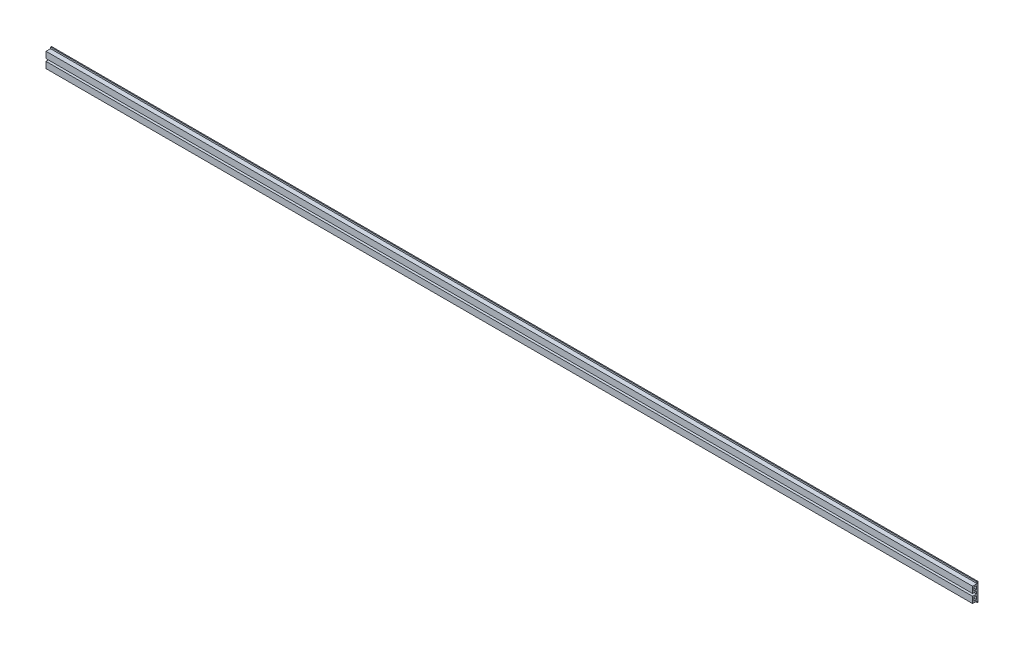
ISO-10303-21;
HEADER;
FILE_DESCRIPTION(('STEP AP214'),'2;1');
FILE_NAME('part.step','',(''),(''),'','','');
FILE_SCHEMA(('AUTOMOTIVE_DESIGN { 1 0 10303 214 1 1 1 1 }'));
ENDSEC;
DATA;
#1=APPLICATION_CONTEXT('core data for automotive mechanical design processes');
#2=APPLICATION_PROTOCOL_DEFINITION('international standard','automotive_design',2000,#1);
#3=PRODUCT_CONTEXT('',#1,'mechanical');
#4=PRODUCT('Part','Part','',(#3));
#5=PRODUCT_RELATED_PRODUCT_CATEGORY('part','',(#4));
#6=PRODUCT_DEFINITION_FORMATION('','',#4);
#7=PRODUCT_DEFINITION_CONTEXT('part definition',#1,'design');
#8=PRODUCT_DEFINITION('design','',#6,#7);
#9=PRODUCT_DEFINITION_SHAPE('','',#8);
#10=(LENGTH_UNIT() NAMED_UNIT(*) SI_UNIT(.MILLI.,.METRE.));
#11=(NAMED_UNIT(*) PLANE_ANGLE_UNIT() SI_UNIT($,.RADIAN.));
#12=(NAMED_UNIT(*) SI_UNIT($,.STERADIAN.) SOLID_ANGLE_UNIT());
#13=UNCERTAINTY_MEASURE_WITH_UNIT(LENGTH_MEASURE(1.E-05),#10,'distance_accuracy_value','');
#14=(GEOMETRIC_REPRESENTATION_CONTEXT(3) GLOBAL_UNCERTAINTY_ASSIGNED_CONTEXT((#13)) GLOBAL_UNIT_ASSIGNED_CONTEXT((#10,
#11,#12)) REPRESENTATION_CONTEXT('',''));
#15=CARTESIAN_POINT('',(0.,0.,0.));
#16=DIRECTION('',(0.,0.,1.));
#17=DIRECTION('',(1.,0.,0.));
#18=AXIS2_PLACEMENT_3D('',#15,#16,#17);
#19=CARTESIAN_POINT('',(-3142.64183905346,-30.,0.));
#20=DIRECTION('',(0.,0.,-1.));
#21=DIRECTION('',(-1.,0.,0.));
#22=AXIS2_PLACEMENT_3D('',#19,#20,#21);
#23=PLANE('',#22);
#24=DIRECTION('',(0.,-1.,0.));
#25=VECTOR('',#24,1.);
#26=CARTESIAN_POINT('',(-3080.,-30.,0.));
#27=LINE('',#26,#25);
#28=CARTESIAN_POINT('',(-3080.,30.,0.));
#29=VERTEX_POINT('',#28);
#30=CARTESIAN_POINT('',(-3080.,-30.,0.));
#31=VERTEX_POINT('',#30);
#32=EDGE_CURVE('E11',#29,#31,#27,.T.);
#33=ORIENTED_EDGE('',*,*,#32,.F.);
#34=DIRECTION('',(1.,0.,0.));
#35=VECTOR('',#34,1.);
#36=CARTESIAN_POINT('',(-3142.64183905346,30.,0.));
#37=LINE('',#36,#35);
#38=CARTESIAN_POINT('',(0.,30.,0.));
#39=VERTEX_POINT('',#38);
#40=EDGE_CURVE('E283',#29,#39,#37,.T.);
#41=ORIENTED_EDGE('',*,*,#40,.T.);
#42=DIRECTION('',(0.,1.,0.));
#43=VECTOR('',#42,1.);
#44=CARTESIAN_POINT('',(0.,-30.,0.));
#45=LINE('',#44,#43);
#46=CARTESIAN_POINT('',(0.,-30.,0.));
#47=VERTEX_POINT('',#46);
#48=EDGE_CURVE('E229',#47,#39,#45,.T.);
#49=ORIENTED_EDGE('',*,*,#48,.F.);
#50=DIRECTION('',(1.,0.,0.));
#51=VECTOR('',#50,1.);
#52=CARTESIAN_POINT('',(-3142.64183905346,-30.,0.));
#53=LINE('',#52,#51);
#54=EDGE_CURVE('E262',#31,#47,#53,.T.);
#55=ORIENTED_EDGE('',*,*,#54,.F.);
#56=EDGE_LOOP('',(#33,#41,#49,#55));
#57=FACE_BOUND('',#56,.T.);
#58=ADVANCED_FACE('F33',(#57),#23,.T.);
#59=CARTESIAN_POINT('',(-3142.64183905346,30.,0.));
#60=DIRECTION('',(0.,1.,0.));
#61=DIRECTION('',(0.,0.,1.));
#62=AXIS2_PLACEMENT_3D('',#59,#60,#61);
#63=PLANE('',#62);
#64=DIRECTION('',(0.,0.,-1.));
#65=VECTOR('',#64,1.);
#66=CARTESIAN_POINT('',(-3080.,30.,0.));
#67=LINE('',#66,#65);
#68=CARTESIAN_POINT('',(-3080.,30.,3.));
#69=VERTEX_POINT('',#68);
#70=EDGE_CURVE('E326',#69,#29,#67,.T.);
#71=ORIENTED_EDGE('',*,*,#70,.F.);
#72=DIRECTION('',(1.,0.,0.));
#73=VECTOR('',#72,1.);
#74=CARTESIAN_POINT('',(-3142.64183905346,30.,3.));
#75=LINE('',#74,#73);
#76=CARTESIAN_POINT('',(0.,30.,3.));
#77=VERTEX_POINT('',#76);
#78=EDGE_CURVE('E281',#69,#77,#75,.T.);
#79=ORIENTED_EDGE('',*,*,#78,.T.);
#80=DIRECTION('',(0.,0.,1.));
#81=VECTOR('',#80,1.);
#82=CARTESIAN_POINT('',(0.,30.,0.));
#83=LINE('',#82,#81);
#84=EDGE_CURVE('E232',#39,#77,#83,.T.);
#85=ORIENTED_EDGE('',*,*,#84,.F.);
#86=ORIENTED_EDGE('',*,*,#40,.F.);
#87=EDGE_LOOP('',(#71,#79,#85,#86));
#88=FACE_BOUND('',#87,.T.);
#89=ADVANCED_FACE('F382',(#88),#63,.T.);
#90=CARTESIAN_POINT('',(-3142.64183905346,30.,3.));
#91=DIRECTION('',(0.,0.,1.));
#92=DIRECTION('',(0.,-1.,0.));
#93=AXIS2_PLACEMENT_3D('',#90,#91,#92);
#94=PLANE('',#93);
#95=DIRECTION('',(0.,1.,0.));
#96=VECTOR('',#95,1.);
#97=CARTESIAN_POINT('',(-3080.,30.,3.));
#98=LINE('',#97,#96);
#99=CARTESIAN_POINT('',(-3080.,25.,3.));
#100=VERTEX_POINT('',#99);
#101=EDGE_CURVE('E332',#100,#69,#98,.T.);
#102=ORIENTED_EDGE('',*,*,#101,.F.);
#103=DIRECTION('',(1.,0.,0.));
#104=VECTOR('',#103,1.);
#105=CARTESIAN_POINT('',(-3142.64183905346,25.,3.));
#106=LINE('',#105,#104);
#107=CARTESIAN_POINT('',(0.,25.,3.));
#108=VERTEX_POINT('',#107);
#109=EDGE_CURVE('E279',#100,#108,#106,.T.);
#110=ORIENTED_EDGE('',*,*,#109,.T.);
#111=DIRECTION('',(0.,-1.,0.));
#112=VECTOR('',#111,1.);
#113=CARTESIAN_POINT('',(0.,30.,3.));
#114=LINE('',#113,#112);
#115=EDGE_CURVE('E235',#77,#108,#114,.T.);
#116=ORIENTED_EDGE('',*,*,#115,.F.);
#117=ORIENTED_EDGE('',*,*,#78,.F.);
#118=EDGE_LOOP('',(#102,#110,#116,#117));
#119=FACE_BOUND('',#118,.T.);
#120=ADVANCED_FACE('F378',(#119),#94,.T.);
#121=CARTESIAN_POINT('',(-3142.64183905346,25.,3.));
#122=DIRECTION('',(0.,1.,0.));
#123=DIRECTION('',(0.,0.,1.));
#124=AXIS2_PLACEMENT_3D('',#121,#122,#123);
#125=PLANE('',#124);
#126=DIRECTION('',(0.,0.,-1.));
#127=VECTOR('',#126,1.);
#128=CARTESIAN_POINT('',(-3080.,25.,2.99999999999997));
#129=LINE('',#128,#127);
#130=CARTESIAN_POINT('',(-3080.,25.,18.));
#131=VERTEX_POINT('',#130);
#132=EDGE_CURVE('E334',#131,#100,#129,.T.);
#133=ORIENTED_EDGE('',*,*,#132,.F.);
#134=DIRECTION('',(1.,0.,0.));
#135=VECTOR('',#134,1.);
#136=CARTESIAN_POINT('',(-3142.64183905346,25.,18.));
#137=LINE('',#136,#135);
#138=CARTESIAN_POINT('',(0.,25.,18.));
#139=VERTEX_POINT('',#138);
#140=EDGE_CURVE('E277',#131,#139,#137,.T.);
#141=ORIENTED_EDGE('',*,*,#140,.T.);
#142=DIRECTION('',(0.,0.,1.));
#143=VECTOR('',#142,1.);
#144=CARTESIAN_POINT('',(0.,25.,3.));
#145=LINE('',#144,#143);
#146=EDGE_CURVE('E238',#108,#139,#145,.T.);
#147=ORIENTED_EDGE('',*,*,#146,.F.);
#148=ORIENTED_EDGE('',*,*,#109,.F.);
#149=EDGE_LOOP('',(#133,#141,#147,#148));
#150=FACE_BOUND('',#149,.T.);
#151=ADVANCED_FACE('F374',(#150),#125,.T.);
#152=CARTESIAN_POINT('',(-3142.64183905346,25.,18.));
#153=DIRECTION('',(0.,0.,1.));
#154=DIRECTION('',(0.,-1.,0.));
#155=AXIS2_PLACEMENT_3D('',#152,#153,#154);
#156=PLANE('',#155);
#157=DIRECTION('',(0.,1.,0.));
#158=VECTOR('',#157,1.);
#159=CARTESIAN_POINT('',(-3080.,25.,18.));
#160=LINE('',#159,#158);
#161=CARTESIAN_POINT('',(-3080.,4.,18.));
#162=VERTEX_POINT('',#161);
#163=EDGE_CURVE('E336',#162,#131,#160,.T.);
#164=ORIENTED_EDGE('',*,*,#163,.F.);
#165=DIRECTION('',(1.,0.,0.));
#166=VECTOR('',#165,1.);
#167=CARTESIAN_POINT('',(-3142.64183905346,4.,18.));
#168=LINE('',#167,#166);
#169=CARTESIAN_POINT('',(0.,4.,18.));
#170=VERTEX_POINT('',#169);
#171=EDGE_CURVE('E275',#162,#170,#168,.T.);
#172=ORIENTED_EDGE('',*,*,#171,.T.);
#173=DIRECTION('',(0.,-1.,0.));
#174=VECTOR('',#173,1.);
#175=CARTESIAN_POINT('',(0.,25.,18.));
#176=LINE('',#175,#174);
#177=EDGE_CURVE('E241',#139,#170,#176,.T.);
#178=ORIENTED_EDGE('',*,*,#177,.F.);
#179=ORIENTED_EDGE('',*,*,#140,.F.);
#180=EDGE_LOOP('',(#164,#172,#178,#179));
#181=FACE_BOUND('',#180,.T.);
#182=ADVANCED_FACE('F368',(#181),#156,.T.);
#183=CARTESIAN_POINT('',(-3142.64183905346,4.,18.));
#184=DIRECTION('',(0.,-1.,0.));
#185=DIRECTION('',(0.,0.,-1.));
#186=AXIS2_PLACEMENT_3D('',#183,#184,#185);
#187=PLANE('',#186);
#188=DIRECTION('',(0.,0.,1.));
#189=VECTOR('',#188,1.);
#190=CARTESIAN_POINT('',(-3080.,4.,18.));
#191=LINE('',#190,#189);
#192=CARTESIAN_POINT('',(-3080.,4.,5.));
#193=VERTEX_POINT('',#192);
#194=EDGE_CURVE('E338',#193,#162,#191,.T.);
#195=ORIENTED_EDGE('',*,*,#194,.F.);
#196=DIRECTION('',(1.,0.,0.));
#197=VECTOR('',#196,1.);
#198=CARTESIAN_POINT('',(-3142.64183905346,4.,5.));
#199=LINE('',#198,#197);
#200=CARTESIAN_POINT('',(0.,4.,5.));
#201=VERTEX_POINT('',#200);
#202=EDGE_CURVE('E273',#193,#201,#199,.T.);
#203=ORIENTED_EDGE('',*,*,#202,.T.);
#204=DIRECTION('',(0.,0.,-1.));
#205=VECTOR('',#204,1.);
#206=CARTESIAN_POINT('',(0.,4.,18.));
#207=LINE('',#206,#205);
#208=EDGE_CURVE('E244',#170,#201,#207,.T.);
#209=ORIENTED_EDGE('',*,*,#208,.F.);
#210=ORIENTED_EDGE('',*,*,#171,.F.);
#211=EDGE_LOOP('',(#195,#203,#209,#210));
#212=FACE_BOUND('',#211,.T.);
#213=ADVANCED_FACE('F365',(#212),#187,.T.);
#214=CARTESIAN_POINT('',(-3142.64183905346,4.,5.));
#215=DIRECTION('',(0.,0.,1.));
#216=DIRECTION('',(0.,-1.,0.));
#217=AXIS2_PLACEMENT_3D('',#214,#215,#216);
#218=PLANE('',#217);
#219=DIRECTION('',(0.,1.,0.));
#220=VECTOR('',#219,1.);
#221=CARTESIAN_POINT('',(-3080.,4.,5.));
#222=LINE('',#221,#220);
#223=CARTESIAN_POINT('',(-3080.,-4.,5.));
#224=VERTEX_POINT('',#223);
#225=EDGE_CURVE('E340',#224,#193,#222,.T.);
#226=ORIENTED_EDGE('',*,*,#225,.F.);
#227=DIRECTION('',(1.,0.,0.));
#228=VECTOR('',#227,1.);
#229=CARTESIAN_POINT('',(-3142.64183905346,-4.,5.));
#230=LINE('',#229,#228);
#231=CARTESIAN_POINT('',(0.,-4.,5.));
#232=VERTEX_POINT('',#231);
#233=EDGE_CURVE('E271',#224,#232,#230,.T.);
#234=ORIENTED_EDGE('',*,*,#233,.T.);
#235=DIRECTION('',(0.,-1.,0.));
#236=VECTOR('',#235,1.);
#237=CARTESIAN_POINT('',(0.,4.,5.));
#238=LINE('',#237,#236);
#239=EDGE_CURVE('E247',#201,#232,#238,.T.);
#240=ORIENTED_EDGE('',*,*,#239,.F.);
#241=ORIENTED_EDGE('',*,*,#202,.F.);
#242=EDGE_LOOP('',(#226,#234,#240,#241));
#243=FACE_BOUND('',#242,.T.);
#244=ADVANCED_FACE('F360',(#243),#218,.T.);
#245=CARTESIAN_POINT('',(-3142.64183905346,-4.,5.));
#246=DIRECTION('',(0.,1.,0.));
#247=DIRECTION('',(0.,0.,1.));
#248=AXIS2_PLACEMENT_3D('',#245,#246,#247);
#249=PLANE('',#248);
#250=DIRECTION('',(0.,0.,-1.));
#251=VECTOR('',#250,1.);
#252=CARTESIAN_POINT('',(-3080.,-4.,4.99999999999997));
#253=LINE('',#252,#251);
#254=CARTESIAN_POINT('',(-3080.,-4.,18.));
#255=VERTEX_POINT('',#254);
#256=EDGE_CURVE('E342',#255,#224,#253,.T.);
#257=ORIENTED_EDGE('',*,*,#256,.F.);
#258=DIRECTION('',(1.,0.,0.));
#259=VECTOR('',#258,1.);
#260=CARTESIAN_POINT('',(-3142.64183905346,-4.,18.));
#261=LINE('',#260,#259);
#262=CARTESIAN_POINT('',(0.,-4.,18.));
#263=VERTEX_POINT('',#262);
#264=EDGE_CURVE('E269',#255,#263,#261,.T.);
#265=ORIENTED_EDGE('',*,*,#264,.T.);
#266=DIRECTION('',(0.,0.,1.));
#267=VECTOR('',#266,1.);
#268=CARTESIAN_POINT('',(0.,-4.,5.));
#269=LINE('',#268,#267);
#270=EDGE_CURVE('E250',#232,#263,#269,.T.);
#271=ORIENTED_EDGE('',*,*,#270,.F.);
#272=ORIENTED_EDGE('',*,*,#233,.F.);
#273=EDGE_LOOP('',(#257,#265,#271,#272));
#274=FACE_BOUND('',#273,.T.);
#275=ADVANCED_FACE('F352',(#274),#249,.T.);
#276=CARTESIAN_POINT('',(-3142.64183905346,-4.,18.));
#277=DIRECTION('',(0.,0.,1.));
#278=DIRECTION('',(1.,0.,0.));
#279=AXIS2_PLACEMENT_3D('',#276,#277,#278);
#280=PLANE('',#279);
#281=DIRECTION('',(0.,1.,0.));
#282=VECTOR('',#281,1.);
#283=CARTESIAN_POINT('',(-3080.,-4.,18.));
#284=LINE('',#283,#282);
#285=CARTESIAN_POINT('',(-3080.,-25.,18.));
#286=VERTEX_POINT('',#285);
#287=EDGE_CURVE('E309',#286,#255,#284,.T.);
#288=ORIENTED_EDGE('',*,*,#287,.F.);
#289=DIRECTION('',(1.,0.,0.));
#290=VECTOR('',#289,1.);
#291=CARTESIAN_POINT('',(-3142.64183905346,-25.,18.));
#292=LINE('',#291,#290);
#293=CARTESIAN_POINT('',(0.,-25.,18.));
#294=VERTEX_POINT('',#293);
#295=EDGE_CURVE('E267',#286,#294,#292,.T.);
#296=ORIENTED_EDGE('',*,*,#295,.T.);
#297=DIRECTION('',(0.,-1.,0.));
#298=VECTOR('',#297,1.);
#299=CARTESIAN_POINT('',(0.,-4.,18.));
#300=LINE('',#299,#298);
#301=EDGE_CURVE('E253',#263,#294,#300,.T.);
#302=ORIENTED_EDGE('',*,*,#301,.F.);
#303=ORIENTED_EDGE('',*,*,#264,.F.);
#304=EDGE_LOOP('',(#288,#296,#302,#303));
#305=FACE_BOUND('',#304,.T.);
#306=ADVANCED_FACE('F355',(#305),#280,.T.);
#307=CARTESIAN_POINT('',(-3142.64183905346,-25.,18.));
#308=DIRECTION('',(0.,-1.,0.));
#309=DIRECTION('',(0.,0.,-1.));
#310=AXIS2_PLACEMENT_3D('',#307,#308,#309);
#311=PLANE('',#310);
#312=DIRECTION('',(0.,0.,1.));
#313=VECTOR('',#312,1.);
#314=CARTESIAN_POINT('',(-3080.,-25.,18.));
#315=LINE('',#314,#313);
#316=CARTESIAN_POINT('',(-3080.,-25.,2.99999999999999));
#317=VERTEX_POINT('',#316);
#318=EDGE_CURVE('E305',#317,#286,#315,.T.);
#319=ORIENTED_EDGE('',*,*,#318,.F.);
#320=DIRECTION('',(1.,0.,0.));
#321=VECTOR('',#320,1.);
#322=CARTESIAN_POINT('',(-3142.64183905346,-25.,2.99999999999999));
#323=LINE('',#322,#321);
#324=CARTESIAN_POINT('',(0.,-25.,2.99999999999999));
#325=VERTEX_POINT('',#324);
#326=EDGE_CURVE('E265',#317,#325,#323,.T.);
#327=ORIENTED_EDGE('',*,*,#326,.T.);
#328=DIRECTION('',(0.,0.,-1.));
#329=VECTOR('',#328,1.);
#330=CARTESIAN_POINT('',(0.,-25.,18.));
#331=LINE('',#330,#329);
#332=EDGE_CURVE('E256',#294,#325,#331,.T.);
#333=ORIENTED_EDGE('',*,*,#332,.F.);
#334=ORIENTED_EDGE('',*,*,#295,.F.);
#335=EDGE_LOOP('',(#319,#327,#333,#334));
#336=FACE_BOUND('',#335,.T.);
#337=ADVANCED_FACE('F403',(#336),#311,.T.);
#338=CARTESIAN_POINT('',(-3142.64183905346,-25.,2.99999999999999));
#339=DIRECTION('',(0.,0.,1.));
#340=DIRECTION('',(0.,-1.,0.));
#341=AXIS2_PLACEMENT_3D('',#338,#339,#340);
#342=PLANE('',#341);
#343=DIRECTION('',(0.,1.,0.));
#344=VECTOR('',#343,1.);
#345=CARTESIAN_POINT('',(-3080.,-25.,2.99999999999999));
#346=LINE('',#345,#344);
#347=CARTESIAN_POINT('',(-3080.,-30.,2.99999999999999));
#348=VERTEX_POINT('',#347);
#349=EDGE_CURVE('E302',#348,#317,#346,.T.);
#350=ORIENTED_EDGE('',*,*,#349,.F.);
#351=DIRECTION('',(1.,0.,0.));
#352=VECTOR('',#351,1.);
#353=CARTESIAN_POINT('',(-3142.64183905346,-30.,2.99999999999999));
#354=LINE('',#353,#352);
#355=CARTESIAN_POINT('',(0.,-30.,2.99999999999999));
#356=VERTEX_POINT('',#355);
#357=EDGE_CURVE('E263',#348,#356,#354,.T.);
#358=ORIENTED_EDGE('',*,*,#357,.T.);
#359=DIRECTION('',(0.,-1.,0.));
#360=VECTOR('',#359,1.);
#361=CARTESIAN_POINT('',(0.,-25.,2.99999999999999));
#362=LINE('',#361,#360);
#363=EDGE_CURVE('E259',#325,#356,#362,.T.);
#364=ORIENTED_EDGE('',*,*,#363,.F.);
#365=ORIENTED_EDGE('',*,*,#326,.F.);
#366=EDGE_LOOP('',(#350,#358,#364,#365));
#367=FACE_BOUND('',#366,.T.);
#368=ADVANCED_FACE('F301',(#367),#342,.T.);
#369=CARTESIAN_POINT('',(-3142.64183905346,-30.,2.99999999999999));
#370=DIRECTION('',(0.,-1.,0.));
#371=DIRECTION('',(0.,0.,-1.));
#372=AXIS2_PLACEMENT_3D('',#369,#370,#371);
#373=PLANE('',#372);
#374=DIRECTION('',(0.,0.,1.));
#375=VECTOR('',#374,1.);
#376=CARTESIAN_POINT('',(-3080.,-30.,2.99999999999996));
#377=LINE('',#376,#375);
#378=EDGE_CURVE('E290',#31,#348,#377,.T.);
#379=ORIENTED_EDGE('',*,*,#378,.F.);
#380=ORIENTED_EDGE('',*,*,#54,.T.);
#381=DIRECTION('',(0.,0.,-1.));
#382=VECTOR('',#381,1.);
#383=CARTESIAN_POINT('',(0.,-30.,2.99999999999999));
#384=LINE('',#383,#382);
#385=EDGE_CURVE('E221',#356,#47,#384,.T.);
#386=ORIENTED_EDGE('',*,*,#385,.F.);
#387=ORIENTED_EDGE('',*,*,#357,.F.);
#388=EDGE_LOOP('',(#379,#380,#386,#387));
#389=FACE_BOUND('',#388,.T.);
#390=ADVANCED_FACE('F35',(#389),#373,.T.);
#391=CARTESIAN_POINT('',(-3142.64183905346,20.,5.));
#392=DIRECTION('',(0.,1.,0.));
#393=DIRECTION('',(0.,0.,1.));
#394=AXIS2_PLACEMENT_3D('',#391,#392,#393);
#395=PLANE('',#394);
#396=DIRECTION('',(1.,0.,0.));
#397=VECTOR('',#396,1.);
#398=CARTESIAN_POINT('',(-3142.64183905346,20.,13.));
#399=LINE('',#398,#397);
#400=CARTESIAN_POINT('',(-3080.,20.,13.));
#401=VERTEX_POINT('',#400);
#402=CARTESIAN_POINT('',(0.,20.,13.));
#403=VERTEX_POINT('',#402);
#404=EDGE_CURVE('E224',#401,#403,#399,.T.);
#405=ORIENTED_EDGE('',*,*,#404,.F.);
#406=DIRECTION('',(0.,0.,-1.));
#407=VECTOR('',#406,1.);
#408=CARTESIAN_POINT('',(-3080.,20.,4.99999999999997));
#409=LINE('',#408,#407);
#410=CARTESIAN_POINT('',(-3080.,20.,5.));
#411=VERTEX_POINT('',#410);
#412=EDGE_CURVE('E52',#401,#411,#409,.T.);
#413=ORIENTED_EDGE('',*,*,#412,.T.);
#414=DIRECTION('',(1.,0.,0.));
#415=VECTOR('',#414,1.);
#416=CARTESIAN_POINT('',(-3142.64183905346,20.,5.));
#417=LINE('',#416,#415);
#418=CARTESIAN_POINT('',(0.,20.,5.));
#419=VERTEX_POINT('',#418);
#420=EDGE_CURVE('E218',#411,#419,#417,.T.);
#421=ORIENTED_EDGE('',*,*,#420,.T.);
#422=DIRECTION('',(0.,0.,1.));
#423=VECTOR('',#422,1.);
#424=CARTESIAN_POINT('',(0.,20.,5.));
#425=LINE('',#424,#423);
#426=EDGE_CURVE('E209',#419,#403,#425,.T.);
#427=ORIENTED_EDGE('',*,*,#426,.T.);
#428=EDGE_LOOP('',(#405,#413,#421,#427));
#429=FACE_BOUND('',#428,.T.);
#430=ADVANCED_FACE('F416',(#429),#395,.F.);
#431=CARTESIAN_POINT('',(-3142.64183905346,20.,13.));
#432=DIRECTION('',(0.,0.,1.));
#433=DIRECTION('',(1.,0.,0.));
#434=AXIS2_PLACEMENT_3D('',#431,#432,#433);
#435=PLANE('',#434);
#436=DIRECTION('',(1.,0.,0.));
#437=VECTOR('',#436,1.);
#438=CARTESIAN_POINT('',(-3142.64183905346,9.,13.));
#439=LINE('',#438,#437);
#440=CARTESIAN_POINT('',(-3080.,9.,13.));
#441=VERTEX_POINT('',#440);
#442=CARTESIAN_POINT('',(0.,9.,13.));
#443=VERTEX_POINT('',#442);
#444=EDGE_CURVE('E222',#441,#443,#439,.T.);
#445=ORIENTED_EDGE('',*,*,#444,.F.);
#446=DIRECTION('',(0.,1.,0.));
#447=VECTOR('',#446,1.);
#448=CARTESIAN_POINT('',(-3080.,20.,13.));
#449=LINE('',#448,#447);
#450=EDGE_CURVE('E43',#441,#401,#449,.T.);
#451=ORIENTED_EDGE('',*,*,#450,.T.);
#452=ORIENTED_EDGE('',*,*,#404,.T.);
#453=DIRECTION('',(0.,-1.,0.));
#454=VECTOR('',#453,1.);
#455=CARTESIAN_POINT('',(0.,20.,13.));
#456=LINE('',#455,#454);
#457=EDGE_CURVE('E212',#403,#443,#456,.T.);
#458=ORIENTED_EDGE('',*,*,#457,.T.);
#459=EDGE_LOOP('',(#445,#451,#452,#458));
#460=FACE_BOUND('',#459,.T.);
#461=ADVANCED_FACE('F419',(#460),#435,.F.);
#462=CARTESIAN_POINT('',(-3142.64183905346,9.,13.));
#463=DIRECTION('',(0.,-1.,0.));
#464=DIRECTION('',(0.,0.,-1.));
#465=AXIS2_PLACEMENT_3D('',#462,#463,#464);
#466=PLANE('',#465);
#467=DIRECTION('',(1.,0.,0.));
#468=VECTOR('',#467,1.);
#469=CARTESIAN_POINT('',(-3142.64183905346,9.,5.));
#470=LINE('',#469,#468);
#471=CARTESIAN_POINT('',(-3080.,9.,5.));
#472=VERTEX_POINT('',#471);
#473=CARTESIAN_POINT('',(0.,9.,5.));
#474=VERTEX_POINT('',#473);
#475=EDGE_CURVE('E219',#472,#474,#470,.T.);
#476=ORIENTED_EDGE('',*,*,#475,.F.);
#477=DIRECTION('',(0.,0.,1.));
#478=VECTOR('',#477,1.);
#479=CARTESIAN_POINT('',(-3080.,9.,13.));
#480=LINE('',#479,#478);
#481=EDGE_CURVE('E72',#472,#441,#480,.T.);
#482=ORIENTED_EDGE('',*,*,#481,.T.);
#483=ORIENTED_EDGE('',*,*,#444,.T.);
#484=DIRECTION('',(0.,0.,-1.));
#485=VECTOR('',#484,1.);
#486=CARTESIAN_POINT('',(0.,9.,13.));
#487=LINE('',#486,#485);
#488=EDGE_CURVE('E215',#443,#474,#487,.T.);
#489=ORIENTED_EDGE('',*,*,#488,.T.);
#490=EDGE_LOOP('',(#476,#482,#483,#489));
#491=FACE_BOUND('',#490,.T.);
#492=ADVANCED_FACE('F414',(#491),#466,.F.);
#493=CARTESIAN_POINT('',(-3142.64183905346,9.,5.));
#494=DIRECTION('',(0.,0.,-1.));
#495=DIRECTION('',(-1.,0.,0.));
#496=AXIS2_PLACEMENT_3D('',#493,#494,#495);
#497=PLANE('',#496);
#498=ORIENTED_EDGE('',*,*,#420,.F.);
#499=DIRECTION('',(0.,-1.,0.));
#500=VECTOR('',#499,1.);
#501=CARTESIAN_POINT('',(-3080.,9.,5.));
#502=LINE('',#501,#500);
#503=EDGE_CURVE('E321',#411,#472,#502,.T.);
#504=ORIENTED_EDGE('',*,*,#503,.T.);
#505=ORIENTED_EDGE('',*,*,#475,.T.);
#506=DIRECTION('',(0.,1.,0.));
#507=VECTOR('',#506,1.);
#508=CARTESIAN_POINT('',(0.,9.,5.));
#509=LINE('',#508,#507);
#510=EDGE_CURVE('E204',#474,#419,#509,.T.);
#511=ORIENTED_EDGE('',*,*,#510,.T.);
#512=EDGE_LOOP('',(#498,#504,#505,#511));
#513=FACE_BOUND('',#512,.T.);
#514=ADVANCED_FACE('F411',(#513),#497,.F.);
#515=CARTESIAN_POINT('',(0.,0.,0.));
#516=DIRECTION('',(1.,0.,0.));
#517=DIRECTION('',(0.,0.,-1.));
#518=AXIS2_PLACEMENT_3D('',#515,#516,#517);
#519=PLANE('',#518);
#520=DIRECTION('',(0.,1.,0.));
#521=VECTOR('',#520,1.);
#522=CARTESIAN_POINT('',(0.,-9.,5.));
#523=LINE('',#522,#521);
#524=CARTESIAN_POINT('',(0.,-20.,5.));
#525=VERTEX_POINT('',#524);
#526=CARTESIAN_POINT('',(0.,-9.,5.));
#527=VERTEX_POINT('',#526);
#528=EDGE_CURVE('E192',#525,#527,#523,.T.);
#529=ORIENTED_EDGE('',*,*,#528,.F.);
#530=DIRECTION('',(0.,0.,-1.));
#531=VECTOR('',#530,1.);
#532=CARTESIAN_POINT('',(0.,-20.,13.));
#533=LINE('',#532,#531);
#534=CARTESIAN_POINT('',(0.,-20.,13.));
#535=VERTEX_POINT('',#534);
#536=EDGE_CURVE('E197',#535,#525,#533,.T.);
#537=ORIENTED_EDGE('',*,*,#536,.F.);
#538=DIRECTION('',(0.,-1.,0.));
#539=VECTOR('',#538,1.);
#540=CARTESIAN_POINT('',(0.,-9.,13.));
#541=LINE('',#540,#539);
#542=CARTESIAN_POINT('',(0.,-9.,13.));
#543=VERTEX_POINT('',#542);
#544=EDGE_CURVE('E179',#543,#535,#541,.T.);
#545=ORIENTED_EDGE('',*,*,#544,.F.);
#546=DIRECTION('',(0.,0.,1.));
#547=VECTOR('',#546,1.);
#548=CARTESIAN_POINT('',(0.,-9.,5.));
#549=LINE('',#548,#547);
#550=EDGE_CURVE('E186',#527,#543,#549,.T.);
#551=ORIENTED_EDGE('',*,*,#550,.F.);
#552=EDGE_LOOP('',(#529,#537,#545,#551));
#553=FACE_BOUND('',#552,.T.);
#554=ORIENTED_EDGE('',*,*,#510,.F.);
#555=ORIENTED_EDGE('',*,*,#488,.F.);
#556=ORIENTED_EDGE('',*,*,#457,.F.);
#557=ORIENTED_EDGE('',*,*,#426,.F.);
#558=EDGE_LOOP('',(#554,#555,#556,#557));
#559=FACE_BOUND('',#558,.T.);
#560=ORIENTED_EDGE('',*,*,#385,.T.);
#561=ORIENTED_EDGE('',*,*,#48,.T.);
#562=ORIENTED_EDGE('',*,*,#84,.T.);
#563=ORIENTED_EDGE('',*,*,#115,.T.);
#564=ORIENTED_EDGE('',*,*,#146,.T.);
#565=ORIENTED_EDGE('',*,*,#177,.T.);
#566=ORIENTED_EDGE('',*,*,#208,.T.);
#567=ORIENTED_EDGE('',*,*,#239,.T.);
#568=ORIENTED_EDGE('',*,*,#270,.T.);
#569=ORIENTED_EDGE('',*,*,#301,.T.);
#570=ORIENTED_EDGE('',*,*,#332,.T.);
#571=ORIENTED_EDGE('',*,*,#363,.T.);
#572=EDGE_LOOP('',(#560,#561,#562,#563,#564,#565,#566,#567,#568,#569,#570,#571));
#573=FACE_BOUND('',#572,.T.);
#574=ADVANCED_FACE('F194',(#553,#559,#573),#519,.T.);
#575=CARTESIAN_POINT('',(-3142.64183905346,-9.,5.));
#576=DIRECTION('',(0.,1.,0.));
#577=DIRECTION('',(0.,0.,1.));
#578=AXIS2_PLACEMENT_3D('',#575,#576,#577);
#579=PLANE('',#578);
#580=DIRECTION('',(1.,0.,0.));
#581=VECTOR('',#580,1.);
#582=CARTESIAN_POINT('',(-3142.64183905346,-9.,13.));
#583=LINE('',#582,#581);
#584=CARTESIAN_POINT('',(-3080.,-9.,13.));
#585=VERTEX_POINT('',#584);
#586=EDGE_CURVE('E175',#585,#543,#583,.T.);
#587=ORIENTED_EDGE('',*,*,#586,.F.);
#588=DIRECTION('',(0.,0.,-1.));
#589=VECTOR('',#588,1.);
#590=CARTESIAN_POINT('',(-3080.,-9.,4.99999999999997));
#591=LINE('',#590,#589);
#592=CARTESIAN_POINT('',(-3080.,-9.,5.));
#593=VERTEX_POINT('',#592);
#594=EDGE_CURVE('E37',#585,#593,#591,.T.);
#595=ORIENTED_EDGE('',*,*,#594,.T.);
#596=DIRECTION('',(1.,0.,0.));
#597=VECTOR('',#596,1.);
#598=CARTESIAN_POINT('',(-3142.64183905346,-9.,5.));
#599=LINE('',#598,#597);
#600=EDGE_CURVE('E183',#593,#527,#599,.T.);
#601=ORIENTED_EDGE('',*,*,#600,.T.);
#602=ORIENTED_EDGE('',*,*,#550,.T.);
#603=EDGE_LOOP('',(#587,#595,#601,#602));
#604=FACE_BOUND('',#603,.T.);
#605=ADVANCED_FACE('F187',(#604),#579,.F.);
#606=CARTESIAN_POINT('',(-3142.64183905346,-9.,13.));
#607=DIRECTION('',(0.,0.,1.));
#608=DIRECTION('',(1.,0.,0.));
#609=AXIS2_PLACEMENT_3D('',#606,#607,#608);
#610=PLANE('',#609);
#611=DIRECTION('',(1.,0.,0.));
#612=VECTOR('',#611,1.);
#613=CARTESIAN_POINT('',(-3142.64183905346,-20.,13.));
#614=LINE('',#613,#612);
#615=CARTESIAN_POINT('',(-3080.,-20.,13.));
#616=VERTEX_POINT('',#615);
#617=EDGE_CURVE('E182',#616,#535,#614,.T.);
#618=ORIENTED_EDGE('',*,*,#617,.F.);
#619=DIRECTION('',(0.,1.,0.));
#620=VECTOR('',#619,1.);
#621=CARTESIAN_POINT('',(-3080.,-9.,13.));
#622=LINE('',#621,#620);
#623=EDGE_CURVE('E66',#616,#585,#622,.T.);
#624=ORIENTED_EDGE('',*,*,#623,.T.);
#625=ORIENTED_EDGE('',*,*,#586,.T.);
#626=ORIENTED_EDGE('',*,*,#544,.T.);
#627=EDGE_LOOP('',(#618,#624,#625,#626));
#628=FACE_BOUND('',#627,.T.);
#629=ADVANCED_FACE('F177',(#628),#610,.F.);
#630=CARTESIAN_POINT('',(-3142.64183905346,-20.,13.));
#631=DIRECTION('',(0.,-1.,0.));
#632=DIRECTION('',(0.,0.,-1.));
#633=AXIS2_PLACEMENT_3D('',#630,#631,#632);
#634=PLANE('',#633);
#635=DIRECTION('',(1.,0.,0.));
#636=VECTOR('',#635,1.);
#637=CARTESIAN_POINT('',(-3142.64183905346,-20.,5.));
#638=LINE('',#637,#636);
#639=CARTESIAN_POINT('',(-3080.,-20.,5.));
#640=VERTEX_POINT('',#639);
#641=EDGE_CURVE('E202',#640,#525,#638,.T.);
#642=ORIENTED_EDGE('',*,*,#641,.F.);
#643=DIRECTION('',(0.,0.,1.));
#644=VECTOR('',#643,1.);
#645=CARTESIAN_POINT('',(-3080.,-20.,13.));
#646=LINE('',#645,#644);
#647=EDGE_CURVE('E319',#640,#616,#646,.T.);
#648=ORIENTED_EDGE('',*,*,#647,.T.);
#649=ORIENTED_EDGE('',*,*,#617,.T.);
#650=ORIENTED_EDGE('',*,*,#536,.T.);
#651=EDGE_LOOP('',(#642,#648,#649,#650));
#652=FACE_BOUND('',#651,.T.);
#653=ADVANCED_FACE('F318',(#652),#634,.F.);
#654=CARTESIAN_POINT('',(-3142.64183905346,-9.,5.));
#655=DIRECTION('',(0.,0.,-1.));
#656=DIRECTION('',(0.,1.,0.));
#657=AXIS2_PLACEMENT_3D('',#654,#655,#656);
#658=PLANE('',#657);
#659=ORIENTED_EDGE('',*,*,#600,.F.);
#660=DIRECTION('',(0.,-1.,0.));
#661=VECTOR('',#660,1.);
#662=CARTESIAN_POINT('',(-3080.,-9.,5.));
#663=LINE('',#662,#661);
#664=EDGE_CURVE('E307',#593,#640,#663,.T.);
#665=ORIENTED_EDGE('',*,*,#664,.T.);
#666=ORIENTED_EDGE('',*,*,#641,.T.);
#667=ORIENTED_EDGE('',*,*,#528,.T.);
#668=EDGE_LOOP('',(#659,#665,#666,#667));
#669=FACE_BOUND('',#668,.T.);
#670=ADVANCED_FACE('F313',(#669),#658,.F.);
#671=CARTESIAN_POINT('',(-3080.,25.9999999999994,-3.9999999999985));
#672=DIRECTION('',(1.,0.,0.));
#673=DIRECTION('',(0.,0.164398987305358,-0.986393923832144));
#674=AXIS2_PLACEMENT_3D('',#671,#672,#673);
#675=PLANE('',#674);
#676=ORIENTED_EDGE('',*,*,#378,.T.);
#677=ORIENTED_EDGE('',*,*,#349,.T.);
#678=ORIENTED_EDGE('',*,*,#318,.T.);
#679=ORIENTED_EDGE('',*,*,#287,.T.);
#680=ORIENTED_EDGE('',*,*,#256,.T.);
#681=ORIENTED_EDGE('',*,*,#225,.T.);
#682=ORIENTED_EDGE('',*,*,#194,.T.);
#683=ORIENTED_EDGE('',*,*,#163,.T.);
#684=ORIENTED_EDGE('',*,*,#132,.T.);
#685=ORIENTED_EDGE('',*,*,#101,.T.);
#686=ORIENTED_EDGE('',*,*,#70,.T.);
#687=ORIENTED_EDGE('',*,*,#32,.T.);
#688=EDGE_LOOP('',(#676,#677,#678,#679,#680,#681,#682,#683,#684,#685,#686,#687));
#689=FACE_BOUND('',#688,.T.);
#690=ORIENTED_EDGE('',*,*,#594,.F.);
#691=ORIENTED_EDGE('',*,*,#623,.F.);
#692=ORIENTED_EDGE('',*,*,#647,.F.);
#693=ORIENTED_EDGE('',*,*,#664,.F.);
#694=EDGE_LOOP('',(#690,#691,#692,#693));
#695=FACE_BOUND('',#694,.T.);
#696=ORIENTED_EDGE('',*,*,#412,.F.);
#697=ORIENTED_EDGE('',*,*,#450,.F.);
#698=ORIENTED_EDGE('',*,*,#481,.F.);
#699=ORIENTED_EDGE('',*,*,#503,.F.);
#700=EDGE_LOOP('',(#696,#697,#698,#699));
#701=FACE_BOUND('',#700,.T.);
#702=ADVANCED_FACE('F345',(#689,#695,#701),#675,.F.);
#703=CLOSED_SHELL('',(#58,#89,#120,#151,#182,#213,#244,#275,#306,#337,#368,#390,#430,#461,#492,
#514,#574,#605,#629,#653,#670,#702));
#704=MANIFOLD_SOLID_BREP('B2',#703);
#705=ADVANCED_BREP_SHAPE_REPRESENTATION('',(#18,#704),#14);
#706=SHAPE_DEFINITION_REPRESENTATION(#9,#705);
ENDSEC;
END-ISO-10303-21;
